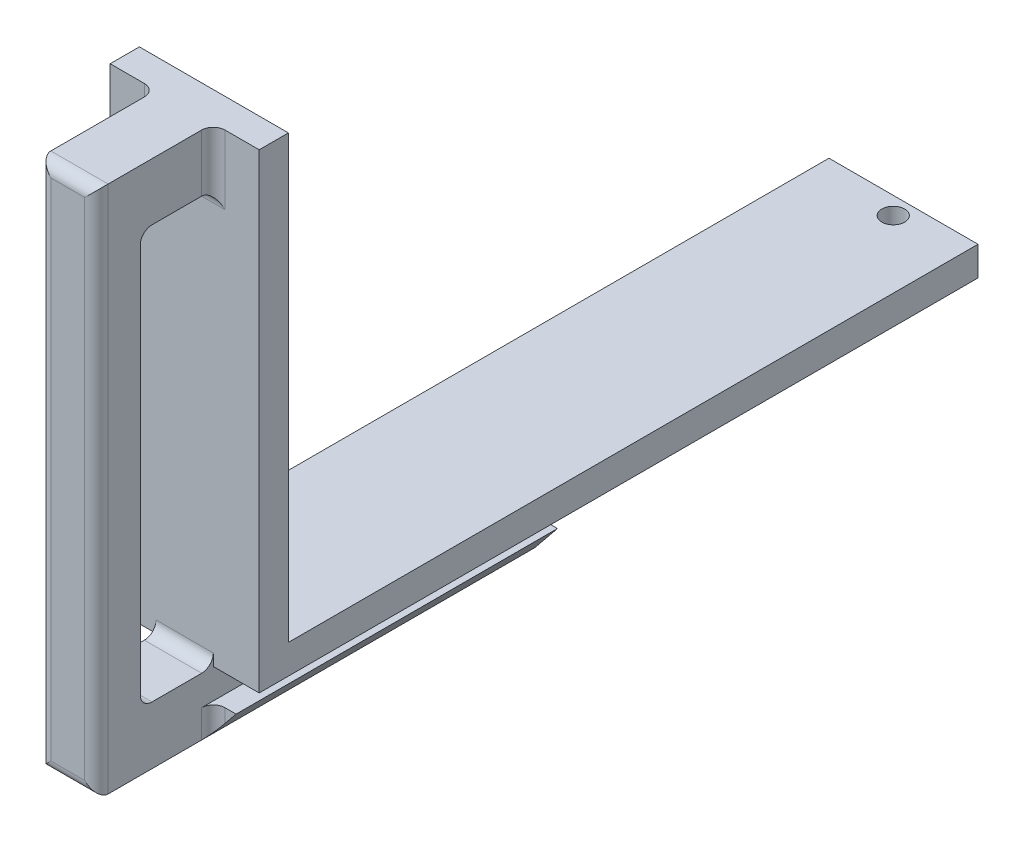
ISO-10303-21;
HEADER;
FILE_DESCRIPTION(('STEP AP214'),'2;1');
FILE_NAME('part.step','',(''),(''),'','','');
FILE_SCHEMA(('AUTOMOTIVE_DESIGN { 1 0 10303 214 1 1 1 1 }'));
ENDSEC;
DATA;
#1=APPLICATION_CONTEXT('core data for automotive mechanical design processes');
#2=APPLICATION_PROTOCOL_DEFINITION('international standard','automotive_design',2000,#1);
#3=PRODUCT_CONTEXT('',#1,'mechanical');
#4=PRODUCT('Part','Part','',(#3));
#5=PRODUCT_RELATED_PRODUCT_CATEGORY('part','',(#4));
#6=PRODUCT_DEFINITION_FORMATION('','',#4);
#7=PRODUCT_DEFINITION_CONTEXT('part definition',#1,'design');
#8=PRODUCT_DEFINITION('design','',#6,#7);
#9=PRODUCT_DEFINITION_SHAPE('','',#8);
#10=(LENGTH_UNIT() NAMED_UNIT(*) SI_UNIT(.MILLI.,.METRE.));
#11=(NAMED_UNIT(*) PLANE_ANGLE_UNIT() SI_UNIT($,.RADIAN.));
#12=(NAMED_UNIT(*) SI_UNIT($,.STERADIAN.) SOLID_ANGLE_UNIT());
#13=UNCERTAINTY_MEASURE_WITH_UNIT(LENGTH_MEASURE(1.E-05),#10,'distance_accuracy_value','');
#14=(GEOMETRIC_REPRESENTATION_CONTEXT(3) GLOBAL_UNCERTAINTY_ASSIGNED_CONTEXT((#13)) GLOBAL_UNIT_ASSIGNED_CONTEXT((#10,
#11,#12)) REPRESENTATION_CONTEXT('',''));
#15=CARTESIAN_POINT('',(0.,0.,0.));
#16=DIRECTION('',(0.,0.,1.));
#17=DIRECTION('',(1.,0.,0.));
#18=AXIS2_PLACEMENT_3D('',#15,#16,#17);
#19=CARTESIAN_POINT('',(0.,0.,64.));
#20=DIRECTION('',(0.,0.,1.));
#21=DIRECTION('',(1.,0.,0.));
#22=AXIS2_PLACEMENT_3D('',#19,#20,#21);
#23=PLANE('',#22);
#24=DIRECTION('',(-1.,0.,0.));
#25=VECTOR('',#24,1.);
#26=CARTESIAN_POINT('',(4.9,-5.1,64.));
#27=LINE('',#26,#25);
#28=CARTESIAN_POINT('',(8.8,-5.1,64.));
#29=VERTEX_POINT('',#28);
#30=CARTESIAN_POINT('',(6.9,-5.1,64.));
#31=VERTEX_POINT('',#30);
#32=EDGE_CURVE('E143',#29,#31,#27,.T.);
#33=ORIENTED_EDGE('',*,*,#32,.T.);
#34=DIRECTION('',(0.,1.,0.));
#35=VECTOR('',#34,1.);
#36=CARTESIAN_POINT('',(6.9,-9.9,64.));
#37=LINE('',#36,#35);
#38=CARTESIAN_POINT('',(6.9,-7.43846153846153,64.));
#39=VERTEX_POINT('',#38);
#40=EDGE_CURVE('E157',#31,#39,#37,.F.);
#41=ORIENTED_EDGE('',*,*,#40,.T.);
#42=DIRECTION('',(0.630592625094465,0.776114000116266,0.));
#43=VECTOR('',#42,1.);
#44=CARTESIAN_POINT('',(8.8,-5.1,64.));
#45=LINE('',#44,#43);
#46=EDGE_CURVE('E159',#39,#29,#45,.T.);
#47=ORIENTED_EDGE('',*,*,#46,.T.);
#48=EDGE_LOOP('',(#33,#41,#47));
#49=FACE_BOUND('',#48,.T.);
#50=ADVANCED_FACE('F44',(#49),#23,.T.);
#51=DIRECTION('',(1.,0.,0.));
#52=VECTOR('',#51,1.);
#53=CARTESIAN_POINT('',(-4.9,0.,64.));
#54=LINE('',#53,#52);
#55=CARTESIAN_POINT('',(-12.75,0.,64.));
#56=VERTEX_POINT('',#55);
#57=CARTESIAN_POINT('',(-4.9,0.,64.));
#58=VERTEX_POINT('',#57);
#59=EDGE_CURVE('E284',#56,#58,#54,.T.);
#60=ORIENTED_EDGE('',*,*,#59,.T.);
#61=DIRECTION('',(0.,1.,0.));
#62=VECTOR('',#61,1.);
#63=CARTESIAN_POINT('',(-4.9,0.,64.));
#64=LINE('',#63,#62);
#65=CARTESIAN_POINT('',(-4.9,2.,64.));
#66=VERTEX_POINT('',#65);
#67=EDGE_CURVE('E71',#58,#66,#64,.T.);
#68=ORIENTED_EDGE('',*,*,#67,.T.);
#69=DIRECTION('',(-1.,0.,0.));
#70=VECTOR('',#69,1.);
#71=CARTESIAN_POINT('',(0.,2.,64.));
#72=LINE('',#71,#70);
#73=CARTESIAN_POINT('',(4.9,2.,64.));
#74=VERTEX_POINT('',#73);
#75=EDGE_CURVE('E270',#66,#74,#72,.F.);
#76=ORIENTED_EDGE('',*,*,#75,.T.);
#77=DIRECTION('',(0.,-1.,0.));
#78=VECTOR('',#77,1.);
#79=CARTESIAN_POINT('',(4.9,-5.1,64.));
#80=LINE('',#79,#78);
#81=CARTESIAN_POINT('',(4.9,0.,64.));
#82=VERTEX_POINT('',#81);
#83=EDGE_CURVE('E265',#74,#82,#80,.T.);
#84=ORIENTED_EDGE('',*,*,#83,.T.);
#85=CARTESIAN_POINT('',(12.75,0.,64.));
#86=VERTEX_POINT('',#85);
#87=EDGE_CURVE('E343',#82,#86,#54,.T.);
#88=ORIENTED_EDGE('',*,*,#87,.T.);
#89=DIRECTION('',(0.,-1.,0.));
#90=VECTOR('',#89,1.);
#91=CARTESIAN_POINT('',(12.75,80.5,64.));
#92=LINE('',#91,#90);
#93=CARTESIAN_POINT('',(12.75,80.5,64.));
#94=VERTEX_POINT('',#93);
#95=EDGE_CURVE('E373',#94,#86,#92,.T.);
#96=ORIENTED_EDGE('',*,*,#95,.F.);
#97=DIRECTION('',(1.,0.,0.));
#98=VECTOR('',#97,1.);
#99=CARTESIAN_POINT('',(-12.75,80.5,64.));
#100=LINE('',#99,#98);
#101=CARTESIAN_POINT('',(6.89999999999999,80.5,64.));
#102=VERTEX_POINT('',#101);
#103=EDGE_CURVE('E348',#102,#94,#100,.T.);
#104=ORIENTED_EDGE('',*,*,#103,.F.);
#105=DIRECTION('',(0.,1.,0.));
#106=VECTOR('',#105,1.);
#107=CARTESIAN_POINT('',(6.89999999999999,70.7,64.));
#108=LINE('',#107,#106);
#109=CARTESIAN_POINT('',(6.89999999999999,68.7,64.));
#110=VERTEX_POINT('',#109);
#111=EDGE_CURVE('E272',#102,#110,#108,.F.);
#112=ORIENTED_EDGE('',*,*,#111,.T.);
#113=DIRECTION('',(1.,0.,0.));
#114=VECTOR('',#113,1.);
#115=CARTESIAN_POINT('',(0.,68.7,64.));
#116=LINE('',#115,#114);
#117=CARTESIAN_POINT('',(-6.90000000000001,68.7,64.));
#118=VERTEX_POINT('',#117);
#119=EDGE_CURVE('E251',#110,#118,#116,.F.);
#120=ORIENTED_EDGE('',*,*,#119,.T.);
#121=DIRECTION('',(0.,-1.,0.));
#122=VECTOR('',#121,1.);
#123=CARTESIAN_POINT('',(-6.90000000000001,80.5,64.));
#124=LINE('',#123,#122);
#125=CARTESIAN_POINT('',(-6.90000000000001,80.5,64.));
#126=VERTEX_POINT('',#125);
#127=EDGE_CURVE('E259',#118,#126,#124,.F.);
#128=ORIENTED_EDGE('',*,*,#127,.T.);
#129=CARTESIAN_POINT('',(-12.75,80.5,64.));
#130=VERTEX_POINT('',#129);
#131=EDGE_CURVE('E344',#130,#126,#100,.T.);
#132=ORIENTED_EDGE('',*,*,#131,.F.);
#133=DIRECTION('',(0.,-1.,0.));
#134=VECTOR('',#133,1.);
#135=CARTESIAN_POINT('',(-12.75,80.5,64.));
#136=LINE('',#135,#134);
#137=EDGE_CURVE('E360',#130,#56,#136,.T.);
#138=ORIENTED_EDGE('',*,*,#137,.T.);
#139=EDGE_LOOP('',(#60,#68,#76,#84,#88,#96,#104,#112,#120,#128,#132,#138));
#140=FACE_BOUND('',#139,.T.);
#141=ADVANCED_FACE('F280',(#140),#23,.T.);
#142=DIRECTION('',(0.630592625094465,-0.776114000116266,0.));
#143=VECTOR('',#142,1.);
#144=CARTESIAN_POINT('',(-8.8,-5.1,64.));
#145=LINE('',#144,#143);
#146=CARTESIAN_POINT('',(-8.8,-5.1,64.));
#147=VERTEX_POINT('',#146);
#148=CARTESIAN_POINT('',(-6.9,-7.43846153846154,64.));
#149=VERTEX_POINT('',#148);
#150=EDGE_CURVE('E381',#147,#149,#145,.T.);
#151=ORIENTED_EDGE('',*,*,#150,.T.);
#152=DIRECTION('',(0.,1.,0.));
#153=VECTOR('',#152,1.);
#154=CARTESIAN_POINT('',(-6.9,-5.1,64.));
#155=LINE('',#154,#153);
#156=CARTESIAN_POINT('',(-6.9,-5.1,64.));
#157=VERTEX_POINT('',#156);
#158=EDGE_CURVE('E169',#149,#157,#155,.T.);
#159=ORIENTED_EDGE('',*,*,#158,.T.);
#160=DIRECTION('',(-1.,0.,0.));
#161=VECTOR('',#160,1.);
#162=CARTESIAN_POINT('',(-4.9,-5.1,64.));
#163=LINE('',#162,#161);
#164=EDGE_CURVE('E377',#157,#147,#163,.T.);
#165=ORIENTED_EDGE('',*,*,#164,.T.);
#166=EDGE_LOOP('',(#151,#159,#165));
#167=FACE_BOUND('',#166,.T.);
#168=ADVANCED_FACE('F687',(#167),#23,.T.);
#169=CARTESIAN_POINT('',(12.75,5.,59.));
#170=DIRECTION('',(-1.,0.,0.));
#171=DIRECTION('',(0.,0.,1.));
#172=AXIS2_PLACEMENT_3D('',#169,#170,#171);
#173=PLANE('',#172);
#174=DIRECTION('',(0.,0.,-1.));
#175=VECTOR('',#174,1.);
#176=CARTESIAN_POINT('',(12.75,0.,59.));
#177=LINE('',#176,#175);
#178=CARTESIAN_POINT('',(12.75,0.,-59.));
#179=VERTEX_POINT('',#178);
#180=EDGE_CURVE('E432',#86,#179,#177,.T.);
#181=ORIENTED_EDGE('',*,*,#180,.T.);
#182=DIRECTION('',(0.,-1.,0.));
#183=VECTOR('',#182,1.);
#184=CARTESIAN_POINT('',(12.75,5.,-59.));
#185=LINE('',#184,#183);
#186=CARTESIAN_POINT('',(12.75,5.,-59.));
#187=VERTEX_POINT('',#186);
#188=EDGE_CURVE('E482',#187,#179,#185,.T.);
#189=ORIENTED_EDGE('',*,*,#188,.F.);
#190=DIRECTION('',(0.,0.,-1.));
#191=VECTOR('',#190,1.);
#192=CARTESIAN_POINT('',(12.75,5.,59.));
#193=LINE('',#192,#191);
#194=CARTESIAN_POINT('',(12.75,5.,59.));
#195=VERTEX_POINT('',#194);
#196=EDGE_CURVE('E451',#195,#187,#193,.T.);
#197=ORIENTED_EDGE('',*,*,#196,.F.);
#198=DIRECTION('',(0.,-1.,0.));
#199=VECTOR('',#198,1.);
#200=CARTESIAN_POINT('',(12.75,80.5,59.));
#201=LINE('',#200,#199);
#202=CARTESIAN_POINT('',(12.75,80.5,59.));
#203=VERTEX_POINT('',#202);
#204=EDGE_CURVE('E369',#203,#195,#201,.T.);
#205=ORIENTED_EDGE('',*,*,#204,.F.);
#206=DIRECTION('',(0.,0.,-1.));
#207=VECTOR('',#206,1.);
#208=CARTESIAN_POINT('',(12.75,80.5,64.));
#209=LINE('',#208,#207);
#210=EDGE_CURVE('E347',#94,#203,#209,.T.);
#211=ORIENTED_EDGE('',*,*,#210,.F.);
#212=ORIENTED_EDGE('',*,*,#95,.T.);
#213=EDGE_LOOP('',(#181,#189,#197,#205,#211,#212));
#214=FACE_BOUND('',#213,.T.);
#215=ADVANCED_FACE('F651',(#214),#173,.F.);
#216=CARTESIAN_POINT('',(-12.75,5.,-59.));
#217=DIRECTION('',(0.,0.,1.));
#218=DIRECTION('',(1.,0.,0.));
#219=AXIS2_PLACEMENT_3D('',#216,#217,#218);
#220=PLANE('',#219);
#221=DIRECTION('',(-1.,0.,0.));
#222=VECTOR('',#221,1.);
#223=CARTESIAN_POINT('',(-12.75,0.,-59.));
#224=LINE('',#223,#222);
#225=CARTESIAN_POINT('',(-12.75,0.,-59.));
#226=VERTEX_POINT('',#225);
#227=EDGE_CURVE('E472',#179,#226,#224,.T.);
#228=ORIENTED_EDGE('',*,*,#227,.T.);
#229=DIRECTION('',(0.,-1.,0.));
#230=VECTOR('',#229,1.);
#231=CARTESIAN_POINT('',(-12.75,5.,-59.));
#232=LINE('',#231,#230);
#233=CARTESIAN_POINT('',(-12.75,5.,-59.));
#234=VERTEX_POINT('',#233);
#235=EDGE_CURVE('E468',#234,#226,#232,.T.);
#236=ORIENTED_EDGE('',*,*,#235,.F.);
#237=DIRECTION('',(-1.,0.,0.));
#238=VECTOR('',#237,1.);
#239=CARTESIAN_POINT('',(-12.75,5.,-59.));
#240=LINE('',#239,#238);
#241=EDGE_CURVE('E455',#187,#234,#240,.T.);
#242=ORIENTED_EDGE('',*,*,#241,.F.);
#243=ORIENTED_EDGE('',*,*,#188,.T.);
#244=EDGE_LOOP('',(#228,#236,#242,#243));
#245=FACE_BOUND('',#244,.T.);
#246=ADVANCED_FACE('F694',(#245),#220,.F.);
#247=CARTESIAN_POINT('',(-12.75,5.,59.));
#248=DIRECTION('',(1.,0.,0.));
#249=DIRECTION('',(0.,0.,-1.));
#250=AXIS2_PLACEMENT_3D('',#247,#248,#249);
#251=PLANE('',#250);
#252=DIRECTION('',(0.,0.,1.));
#253=VECTOR('',#252,1.);
#254=CARTESIAN_POINT('',(-12.75,0.,59.));
#255=LINE('',#254,#253);
#256=EDGE_CURVE('E456',#226,#56,#255,.T.);
#257=ORIENTED_EDGE('',*,*,#256,.T.);
#258=ORIENTED_EDGE('',*,*,#137,.F.);
#259=DIRECTION('',(0.,0.,1.));
#260=VECTOR('',#259,1.);
#261=CARTESIAN_POINT('',(-12.75,80.5,59.));
#262=LINE('',#261,#260);
#263=CARTESIAN_POINT('',(-12.75,80.5,59.));
#264=VERTEX_POINT('',#263);
#265=EDGE_CURVE('E356',#264,#130,#262,.T.);
#266=ORIENTED_EDGE('',*,*,#265,.F.);
#267=DIRECTION('',(0.,-1.,0.));
#268=VECTOR('',#267,1.);
#269=CARTESIAN_POINT('',(-12.75,80.5,59.));
#270=LINE('',#269,#268);
#271=CARTESIAN_POINT('',(-12.75,5.,59.));
#272=VERTEX_POINT('',#271);
#273=EDGE_CURVE('E365',#264,#272,#270,.T.);
#274=ORIENTED_EDGE('',*,*,#273,.T.);
#275=DIRECTION('',(0.,0.,1.));
#276=VECTOR('',#275,1.);
#277=CARTESIAN_POINT('',(-12.75,5.,59.));
#278=LINE('',#277,#276);
#279=EDGE_CURVE('E460',#234,#272,#278,.T.);
#280=ORIENTED_EDGE('',*,*,#279,.F.);
#281=ORIENTED_EDGE('',*,*,#235,.T.);
#282=EDGE_LOOP('',(#257,#258,#266,#274,#280,#281));
#283=FACE_BOUND('',#282,.T.);
#284=ADVANCED_FACE('F661',(#283),#251,.F.);
#285=CARTESIAN_POINT('',(0.,5.,0.));
#286=DIRECTION('',(0.,-1.,0.));
#287=DIRECTION('',(0.,0.,-1.));
#288=AXIS2_PLACEMENT_3D('',#285,#286,#287);
#289=PLANE('',#288);
#290=CARTESIAN_POINT('',(1.24999999999997,5.,-56.));
#291=DIRECTION('',(0.,1.,0.));
#292=DIRECTION('',(0.,0.,1.));
#293=AXIS2_PLACEMENT_3D('',#290,#291,#292);
#294=CIRCLE('',#293,1.95);
#295=CARTESIAN_POINT('',(1.24999999999997,5.,-54.05));
#296=VERTEX_POINT('',#295);
#297=EDGE_CURVE('E387',#296,#296,#294,.T.);
#298=ORIENTED_EDGE('',*,*,#297,.F.);
#299=EDGE_LOOP('',(#298));
#300=FACE_BOUND('',#299,.T.);
#301=CARTESIAN_POINT('',(1.24999999999998,5.,56.));
#302=DIRECTION('',(0.,1.,0.));
#303=DIRECTION('',(0.,0.,1.));
#304=AXIS2_PLACEMENT_3D('',#301,#302,#303);
#305=CIRCLE('',#304,1.95);
#306=CARTESIAN_POINT('',(1.24999999999998,5.,57.95));
#307=VERTEX_POINT('',#306);
#308=EDGE_CURVE('E392',#307,#307,#305,.T.);
#309=ORIENTED_EDGE('',*,*,#308,.F.);
#310=EDGE_LOOP('',(#309));
#311=FACE_BOUND('',#310,.T.);
#312=ORIENTED_EDGE('',*,*,#196,.T.);
#313=ORIENTED_EDGE('',*,*,#241,.T.);
#314=ORIENTED_EDGE('',*,*,#279,.T.);
#315=DIRECTION('',(1.,0.,0.));
#316=VECTOR('',#315,1.);
#317=CARTESIAN_POINT('',(-12.75,5.,59.));
#318=LINE('',#317,#316);
#319=EDGE_CURVE('E464',#272,#195,#318,.T.);
#320=ORIENTED_EDGE('',*,*,#319,.T.);
#321=EDGE_LOOP('',(#312,#313,#314,#320));
#322=FACE_BOUND('',#321,.T.);
#323=ADVANCED_FACE('F1030',(#300,#311,#322),#289,.F.);
#324=CARTESIAN_POINT('',(0.,0.,0.));
#325=DIRECTION('',(0.,-1.,0.));
#326=DIRECTION('',(0.,0.,-1.));
#327=AXIS2_PLACEMENT_3D('',#324,#325,#326);
#328=PLANE('',#327);
#329=CARTESIAN_POINT('',(1.24999999999997,0.,-56.));
#330=DIRECTION('',(0.,-1.,0.));
#331=DIRECTION('',(0.,0.,-1.));
#332=AXIS2_PLACEMENT_3D('',#329,#330,#331);
#333=CIRCLE('',#332,1.95);
#334=CARTESIAN_POINT('',(1.24999999999997,0.,-57.95));
#335=VERTEX_POINT('',#334);
#336=EDGE_CURVE('E391',#335,#335,#333,.T.);
#337=ORIENTED_EDGE('',*,*,#336,.F.);
#338=EDGE_LOOP('',(#337));
#339=FACE_BOUND('',#338,.T.);
#340=DIRECTION('',(0.,0.,1.));
#341=VECTOR('',#340,1.);
#342=CARTESIAN_POINT('',(4.9,0.,8.99999999999999));
#343=LINE('',#342,#341);
#344=CARTESIAN_POINT('',(4.9,0.,8.99999999999999));
#345=VERTEX_POINT('',#344);
#346=EDGE_CURVE('E429',#345,#82,#343,.T.);
#347=ORIENTED_EDGE('',*,*,#346,.F.);
#348=DIRECTION('',(-1.,0.,0.));
#349=VECTOR('',#348,1.);
#350=CARTESIAN_POINT('',(4.9,0.,8.99999999999999));
#351=LINE('',#350,#349);
#352=CARTESIAN_POINT('',(-4.9,0.,8.99999999999999));
#353=VERTEX_POINT('',#352);
#354=EDGE_CURVE('E399',#345,#353,#351,.T.);
#355=ORIENTED_EDGE('',*,*,#354,.T.);
#356=DIRECTION('',(0.,0.,1.));
#357=VECTOR('',#356,1.);
#358=CARTESIAN_POINT('',(-4.9,0.,8.99999999999999));
#359=LINE('',#358,#357);
#360=EDGE_CURVE('E428',#353,#58,#359,.T.);
#361=ORIENTED_EDGE('',*,*,#360,.T.);
#362=ORIENTED_EDGE('',*,*,#59,.F.);
#363=ORIENTED_EDGE('',*,*,#256,.F.);
#364=ORIENTED_EDGE('',*,*,#227,.F.);
#365=ORIENTED_EDGE('',*,*,#180,.F.);
#366=ORIENTED_EDGE('',*,*,#87,.F.);
#367=EDGE_LOOP('',(#347,#355,#361,#362,#363,#364,#365,#366));
#368=FACE_BOUND('',#367,.T.);
#369=ADVANCED_FACE('F667',(#339,#368),#328,.T.);
#370=CARTESIAN_POINT('',(4.9,-5.1,8.99999999999999));
#371=DIRECTION('',(1.,0.,0.));
#372=DIRECTION('',(0.,1.,0.));
#373=AXIS2_PLACEMENT_3D('',#370,#371,#372);
#374=PLANE('',#373);
#375=DIRECTION('',(0.,0.,-1.));
#376=VECTOR('',#375,1.);
#377=CARTESIAN_POINT('',(4.90000000000001,80.5,76.5));
#378=LINE('',#377,#376);
#379=CARTESIAN_POINT('',(4.90000000000001,80.5,82.));
#380=VERTEX_POINT('',#379);
#381=CARTESIAN_POINT('',(4.90000000000001,80.5,66.));
#382=VERTEX_POINT('',#381);
#383=EDGE_CURVE('E339',#380,#382,#378,.T.);
#384=ORIENTED_EDGE('',*,*,#383,.F.);
#385=DIRECTION('',(0.,1.,0.));
#386=VECTOR('',#385,1.);
#387=CARTESIAN_POINT('',(4.9,-9.9,82.));
#388=LINE('',#387,#386);
#389=CARTESIAN_POINT('',(4.89999999999999,-9.9,82.));
#390=VERTEX_POINT('',#389);
#391=EDGE_CURVE('E516',#380,#390,#388,.F.);
#392=ORIENTED_EDGE('',*,*,#391,.T.);
#393=DIRECTION('',(0.,0.,-1.));
#394=VECTOR('',#393,1.);
#395=CARTESIAN_POINT('',(4.89999999999999,-9.9,76.5));
#396=LINE('',#395,#394);
#397=CARTESIAN_POINT('',(4.89999999999999,-9.9,66.));
#398=VERTEX_POINT('',#397);
#399=EDGE_CURVE('E324',#390,#398,#396,.T.);
#400=ORIENTED_EDGE('',*,*,#399,.T.);
#401=DIRECTION('',(0.,1.,0.));
#402=VECTOR('',#401,1.);
#403=CARTESIAN_POINT('',(4.9,-5.1,66.));
#404=LINE('',#403,#402);
#405=CARTESIAN_POINT('',(4.9,-5.1,66.));
#406=VERTEX_POINT('',#405);
#407=EDGE_CURVE('E513',#398,#406,#404,.T.);
#408=ORIENTED_EDGE('',*,*,#407,.T.);
#409=DIRECTION('',(0.,0.,1.));
#410=VECTOR('',#409,1.);
#411=CARTESIAN_POINT('',(4.9,-5.1,8.99999999999999));
#412=LINE('',#411,#410);
#413=CARTESIAN_POINT('',(4.9,-5.1,8.99999999999999));
#414=VERTEX_POINT('',#413);
#415=EDGE_CURVE('E146',#414,#406,#412,.T.);
#416=ORIENTED_EDGE('',*,*,#415,.F.);
#417=DIRECTION('',(0.,1.,0.));
#418=VECTOR('',#417,1.);
#419=CARTESIAN_POINT('',(4.9,-5.1,8.99999999999999));
#420=LINE('',#419,#418);
#421=EDGE_CURVE('E424',#414,#345,#420,.T.);
#422=ORIENTED_EDGE('',*,*,#421,.T.);
#423=ORIENTED_EDGE('',*,*,#346,.T.);
#424=ORIENTED_EDGE('',*,*,#83,.F.);
#425=CARTESIAN_POINT('',(4.9,2.,66.));
#426=DIRECTION('',(1.,0.,0.));
#427=DIRECTION('',(0.,1.,0.));
#428=AXIS2_PLACEMENT_3D('',#425,#426,#427);
#429=CIRCLE('',#428,2.);
#430=CARTESIAN_POINT('',(4.89999999999999,0.,66.));
#431=VERTEX_POINT('',#430);
#432=EDGE_CURVE('E193',#74,#431,#429,.F.);
#433=ORIENTED_EDGE('',*,*,#432,.T.);
#434=DIRECTION('',(0.,0.,-1.));
#435=VECTOR('',#434,1.);
#436=CARTESIAN_POINT('',(4.89999999999999,0.,76.5));
#437=LINE('',#436,#435);
#438=CARTESIAN_POINT('',(4.89999999999999,0.,74.5));
#439=VERTEX_POINT('',#438);
#440=EDGE_CURVE('E298',#439,#431,#437,.T.);
#441=ORIENTED_EDGE('',*,*,#440,.F.);
#442=CARTESIAN_POINT('',(4.9,2.,74.5));
#443=DIRECTION('',(1.,0.,0.));
#444=DIRECTION('',(0.,1.,0.));
#445=AXIS2_PLACEMENT_3D('',#442,#443,#444);
#446=CIRCLE('',#445,2.);
#447=CARTESIAN_POINT('',(4.89999999999999,2.,76.5));
#448=VERTEX_POINT('',#447);
#449=EDGE_CURVE('E215',#439,#448,#446,.F.);
#450=ORIENTED_EDGE('',*,*,#449,.T.);
#451=DIRECTION('',(0.,1.,0.));
#452=VECTOR('',#451,1.);
#453=CARTESIAN_POINT('',(4.89999999999999,80.5,76.5));
#454=LINE('',#453,#452);
#455=CARTESIAN_POINT('',(4.89999999999999,68.7,76.5));
#456=VERTEX_POINT('',#455);
#457=EDGE_CURVE('E312',#448,#456,#454,.T.);
#458=ORIENTED_EDGE('',*,*,#457,.T.);
#459=CARTESIAN_POINT('',(4.89999999999999,68.7,74.5));
#460=DIRECTION('',(1.,0.,0.));
#461=DIRECTION('',(0.,1.,0.));
#462=AXIS2_PLACEMENT_3D('',#459,#460,#461);
#463=CIRCLE('',#462,2.);
#464=CARTESIAN_POINT('',(4.90000000000001,70.7,74.5));
#465=VERTEX_POINT('',#464);
#466=EDGE_CURVE('E205',#456,#465,#463,.F.);
#467=ORIENTED_EDGE('',*,*,#466,.T.);
#468=DIRECTION('',(0.,0.,-1.));
#469=VECTOR('',#468,1.);
#470=CARTESIAN_POINT('',(4.90000000000001,70.7,76.5));
#471=LINE('',#470,#469);
#472=CARTESIAN_POINT('',(4.90000000000001,70.7,66.));
#473=VERTEX_POINT('',#472);
#474=EDGE_CURVE('E327',#465,#473,#471,.T.);
#475=ORIENTED_EDGE('',*,*,#474,.T.);
#476=DIRECTION('',(0.,1.,0.));
#477=VECTOR('',#476,1.);
#478=CARTESIAN_POINT('',(4.89999999999999,80.5,66.));
#479=LINE('',#478,#477);
#480=EDGE_CURVE('E509',#473,#382,#479,.T.);
#481=ORIENTED_EDGE('',*,*,#480,.T.);
#482=EDGE_LOOP('',(#384,#392,#400,#408,#416,#422,#423,#424,#433,#441,#450,#458,#467,#475,#481));
#483=FACE_BOUND('',#482,.T.);
#484=ADVANCED_FACE('F296',(#483),#374,.T.);
#485=CARTESIAN_POINT('',(4.9,-5.1,8.99999999999999));
#486=DIRECTION('',(0.,1.,0.));
#487=DIRECTION('',(0.,0.,1.));
#488=AXIS2_PLACEMENT_3D('',#485,#486,#487);
#489=PLANE('',#488);
#490=ORIENTED_EDGE('',*,*,#415,.T.);
#491=CARTESIAN_POINT('',(6.9,-5.1,66.));
#492=DIRECTION('',(0.,1.,0.));
#493=DIRECTION('',(0.,0.,1.));
#494=AXIS2_PLACEMENT_3D('',#491,#492,#493);
#495=CIRCLE('',#494,2.);
#496=EDGE_CURVE('E138',#406,#31,#495,.F.);
#497=ORIENTED_EDGE('',*,*,#496,.T.);
#498=ORIENTED_EDGE('',*,*,#32,.F.);
#499=DIRECTION('',(0.,0.,1.));
#500=VECTOR('',#499,1.);
#501=CARTESIAN_POINT('',(8.8,-5.1,8.99999999999999));
#502=LINE('',#501,#500);
#503=CARTESIAN_POINT('',(8.8,-5.1,8.99999999999999));
#504=VERTEX_POINT('',#503);
#505=EDGE_CURVE('E435',#504,#29,#502,.T.);
#506=ORIENTED_EDGE('',*,*,#505,.F.);
#507=DIRECTION('',(-1.,0.,0.));
#508=VECTOR('',#507,1.);
#509=CARTESIAN_POINT('',(4.9,-5.1,8.99999999999999));
#510=LINE('',#509,#508);
#511=EDGE_CURVE('E421',#504,#414,#510,.T.);
#512=ORIENTED_EDGE('',*,*,#511,.T.);
#513=EDGE_LOOP('',(#490,#497,#498,#506,#512));
#514=FACE_BOUND('',#513,.T.);
#515=ADVANCED_FACE('F140',(#514),#489,.T.);
#516=CARTESIAN_POINT('',(8.8,-5.1,8.99999999999999));
#517=DIRECTION('',(0.776114000116266,-0.630592625094465,0.));
#518=DIRECTION('',(0.630592625094465,0.776114000116266,0.));
#519=AXIS2_PLACEMENT_3D('',#516,#517,#518);
#520=PLANE('',#519);
#521=ORIENTED_EDGE('',*,*,#505,.T.);
#522=ORIENTED_EDGE('',*,*,#46,.F.);
#523=CARTESIAN_POINT('',(6.9,-7.43846153846153,66.));
#524=DIRECTION('',(0.776114000116266,-0.630592625094465,0.));
#525=DIRECTION('',(-0.630592625094465,-0.776114000116266,0.));
#526=AXIS2_PLACEMENT_3D('',#523,#524,#525);
#527=ELLIPSE('',#526,3.17161971201359,2.);
#528=EDGE_CURVE('E152',#39,#398,#527,.F.);
#529=ORIENTED_EDGE('',*,*,#528,.T.);
#530=DIRECTION('',(0.,0.,1.));
#531=VECTOR('',#530,1.);
#532=CARTESIAN_POINT('',(4.9,-9.9,8.99999999999999));
#533=LINE('',#532,#531);
#534=CARTESIAN_POINT('',(4.9,-9.9,8.99999999999999));
#535=VERTEX_POINT('',#534);
#536=EDGE_CURVE('E62',#535,#398,#533,.T.);
#537=ORIENTED_EDGE('',*,*,#536,.F.);
#538=DIRECTION('',(0.630592625094465,0.776114000116266,0.));
#539=VECTOR('',#538,1.);
#540=CARTESIAN_POINT('',(8.8,-5.1,8.99999999999999));
#541=LINE('',#540,#539);
#542=EDGE_CURVE('E417',#535,#504,#541,.T.);
#543=ORIENTED_EDGE('',*,*,#542,.T.);
#544=EDGE_LOOP('',(#521,#522,#529,#537,#543));
#545=FACE_BOUND('',#544,.T.);
#546=ADVANCED_FACE('F731',(#545),#520,.T.);
#547=CARTESIAN_POINT('',(-4.9,-9.9,8.99999999999999));
#548=DIRECTION('',(0.,-1.,0.));
#549=DIRECTION('',(1.,0.,0.));
#550=AXIS2_PLACEMENT_3D('',#547,#548,#549);
#551=PLANE('',#550);
#552=ORIENTED_EDGE('',*,*,#399,.F.);
#553=DIRECTION('',(1.,0.,0.));
#554=VECTOR('',#553,1.);
#555=CARTESIAN_POINT('',(-4.90000000000001,-9.9,82.));
#556=LINE('',#555,#554);
#557=CARTESIAN_POINT('',(-4.90000000000001,-9.9,82.));
#558=VERTEX_POINT('',#557);
#559=EDGE_CURVE('E95',#390,#558,#556,.F.);
#560=ORIENTED_EDGE('',*,*,#559,.T.);
#561=DIRECTION('',(0.,0.,-1.));
#562=VECTOR('',#561,1.);
#563=CARTESIAN_POINT('',(-4.90000000000001,-9.9,76.5));
#564=LINE('',#563,#562);
#565=CARTESIAN_POINT('',(-4.9,-9.9,66.));
#566=VERTEX_POINT('',#565);
#567=EDGE_CURVE('E316',#558,#566,#564,.T.);
#568=ORIENTED_EDGE('',*,*,#567,.T.);
#569=DIRECTION('',(0.,0.,1.));
#570=VECTOR('',#569,1.);
#571=CARTESIAN_POINT('',(-4.9,-9.9,8.99999999999999));
#572=LINE('',#571,#570);
#573=CARTESIAN_POINT('',(-4.9,-9.9,8.99999999999999));
#574=VERTEX_POINT('',#573);
#575=EDGE_CURVE('E85',#574,#566,#572,.T.);
#576=ORIENTED_EDGE('',*,*,#575,.F.);
#577=DIRECTION('',(1.,0.,0.));
#578=VECTOR('',#577,1.);
#579=CARTESIAN_POINT('',(-4.9,-9.9,8.99999999999999));
#580=LINE('',#579,#578);
#581=EDGE_CURVE('E414',#574,#535,#580,.T.);
#582=ORIENTED_EDGE('',*,*,#581,.T.);
#583=ORIENTED_EDGE('',*,*,#536,.T.);
#584=EDGE_LOOP('',(#552,#560,#568,#576,#582,#583));
#585=FACE_BOUND('',#584,.T.);
#586=ADVANCED_FACE('F560',(#585),#551,.T.);
#587=CARTESIAN_POINT('',(-8.8,-5.1,8.99999999999999));
#588=DIRECTION('',(-0.776114000116266,-0.630592625094465,0.));
#589=DIRECTION('',(0.630592625094465,-0.776114000116266,0.));
#590=AXIS2_PLACEMENT_3D('',#587,#588,#589);
#591=PLANE('',#590);
#592=ORIENTED_EDGE('',*,*,#575,.T.);
#593=CARTESIAN_POINT('',(-6.9,-7.43846153846154,66.));
#594=DIRECTION('',(-0.776114000116266,-0.630592625094465,0.));
#595=DIRECTION('',(0.630592625094465,-0.776114000116266,0.));
#596=AXIS2_PLACEMENT_3D('',#593,#594,#595);
#597=ELLIPSE('',#596,3.17161971201359,2.);
#598=EDGE_CURVE('E153',#566,#149,#597,.F.);
#599=ORIENTED_EDGE('',*,*,#598,.T.);
#600=ORIENTED_EDGE('',*,*,#150,.F.);
#601=DIRECTION('',(0.,0.,1.));
#602=VECTOR('',#601,1.);
#603=CARTESIAN_POINT('',(-8.8,-5.1,8.99999999999999));
#604=LINE('',#603,#602);
#605=CARTESIAN_POINT('',(-8.8,-5.1,8.99999999999999));
#606=VERTEX_POINT('',#605);
#607=EDGE_CURVE('E442',#606,#147,#604,.T.);
#608=ORIENTED_EDGE('',*,*,#607,.F.);
#609=DIRECTION('',(0.630592625094465,-0.776114000116266,0.));
#610=VECTOR('',#609,1.);
#611=CARTESIAN_POINT('',(-8.8,-5.1,8.99999999999999));
#612=LINE('',#611,#610);
#613=EDGE_CURVE('E411',#606,#574,#612,.T.);
#614=ORIENTED_EDGE('',*,*,#613,.T.);
#615=EDGE_LOOP('',(#592,#599,#600,#608,#614));
#616=FACE_BOUND('',#615,.T.);
#617=ADVANCED_FACE('F685',(#616),#591,.T.);
#618=CARTESIAN_POINT('',(-4.9,-5.1,8.99999999999999));
#619=DIRECTION('',(0.,1.,0.));
#620=DIRECTION('',(-1.,0.,0.));
#621=AXIS2_PLACEMENT_3D('',#618,#619,#620);
#622=PLANE('',#621);
#623=ORIENTED_EDGE('',*,*,#607,.T.);
#624=ORIENTED_EDGE('',*,*,#164,.F.);
#625=CARTESIAN_POINT('',(-6.9,-5.1,66.));
#626=DIRECTION('',(0.,1.,0.));
#627=DIRECTION('',(-1.,0.,0.));
#628=AXIS2_PLACEMENT_3D('',#625,#626,#627);
#629=CIRCLE('',#628,2.);
#630=CARTESIAN_POINT('',(-4.9,-5.1,66.));
#631=VERTEX_POINT('',#630);
#632=EDGE_CURVE('E197',#157,#631,#629,.F.);
#633=ORIENTED_EDGE('',*,*,#632,.T.);
#634=DIRECTION('',(0.,0.,1.));
#635=VECTOR('',#634,1.);
#636=CARTESIAN_POINT('',(-4.9,-5.1,8.99999999999999));
#637=LINE('',#636,#635);
#638=CARTESIAN_POINT('',(-4.9,-5.1,8.99999999999999));
#639=VERTEX_POINT('',#638);
#640=EDGE_CURVE('E446',#639,#631,#637,.T.);
#641=ORIENTED_EDGE('',*,*,#640,.F.);
#642=DIRECTION('',(-1.,0.,0.));
#643=VECTOR('',#642,1.);
#644=CARTESIAN_POINT('',(-4.9,-5.1,8.99999999999999));
#645=LINE('',#644,#643);
#646=EDGE_CURVE('E407',#639,#606,#645,.T.);
#647=ORIENTED_EDGE('',*,*,#646,.T.);
#648=EDGE_LOOP('',(#623,#624,#633,#641,#647));
#649=FACE_BOUND('',#648,.T.);
#650=ADVANCED_FACE('F677',(#649),#622,.T.);
#651=CARTESIAN_POINT('',(-4.9,0.,8.99999999999999));
#652=DIRECTION('',(-1.,0.,0.));
#653=DIRECTION('',(0.,-1.,0.));
#654=AXIS2_PLACEMENT_3D('',#651,#652,#653);
#655=PLANE('',#654);
#656=ORIENTED_EDGE('',*,*,#567,.F.);
#657=DIRECTION('',(0.,-1.,0.));
#658=VECTOR('',#657,1.);
#659=CARTESIAN_POINT('',(-4.90000000000001,80.5,82.));
#660=LINE('',#659,#658);
#661=CARTESIAN_POINT('',(-4.9,80.5,82.));
#662=VERTEX_POINT('',#661);
#663=EDGE_CURVE('E527',#558,#662,#660,.F.);
#664=ORIENTED_EDGE('',*,*,#663,.T.);
#665=DIRECTION('',(0.,0.,-1.));
#666=VECTOR('',#665,1.);
#667=CARTESIAN_POINT('',(-4.9,80.5,76.5));
#668=LINE('',#667,#666);
#669=CARTESIAN_POINT('',(-4.9,80.5,66.));
#670=VERTEX_POINT('',#669);
#671=EDGE_CURVE('E335',#662,#670,#668,.T.);
#672=ORIENTED_EDGE('',*,*,#671,.T.);
#673=DIRECTION('',(0.,-1.,0.));
#674=VECTOR('',#673,1.);
#675=CARTESIAN_POINT('',(-4.90000000000001,70.7,66.));
#676=LINE('',#675,#674);
#677=CARTESIAN_POINT('',(-4.9,70.7,66.));
#678=VERTEX_POINT('',#677);
#679=EDGE_CURVE('E257',#670,#678,#676,.T.);
#680=ORIENTED_EDGE('',*,*,#679,.T.);
#681=DIRECTION('',(0.,0.,-1.));
#682=VECTOR('',#681,1.);
#683=CARTESIAN_POINT('',(-4.9,70.7,76.5));
#684=LINE('',#683,#682);
#685=CARTESIAN_POINT('',(-4.9,70.7,74.5));
#686=VERTEX_POINT('',#685);
#687=EDGE_CURVE('E331',#686,#678,#684,.T.);
#688=ORIENTED_EDGE('',*,*,#687,.F.);
#689=CARTESIAN_POINT('',(-4.90000000000001,68.7,74.5));
#690=DIRECTION('',(-1.,0.,0.));
#691=DIRECTION('',(0.,-1.,0.));
#692=AXIS2_PLACEMENT_3D('',#689,#690,#691);
#693=CIRCLE('',#692,2.);
#694=CARTESIAN_POINT('',(-4.9,68.7,76.5));
#695=VERTEX_POINT('',#694);
#696=EDGE_CURVE('E209',#686,#695,#693,.F.);
#697=ORIENTED_EDGE('',*,*,#696,.T.);
#698=DIRECTION('',(0.,-1.,0.));
#699=VECTOR('',#698,1.);
#700=CARTESIAN_POINT('',(-4.90000000000001,-9.9,76.5));
#701=LINE('',#700,#699);
#702=CARTESIAN_POINT('',(-4.90000000000001,2.,76.5));
#703=VERTEX_POINT('',#702);
#704=EDGE_CURVE('E237',#695,#703,#701,.T.);
#705=ORIENTED_EDGE('',*,*,#704,.T.);
#706=CARTESIAN_POINT('',(-4.9,2.,74.5));
#707=DIRECTION('',(-1.,0.,0.));
#708=DIRECTION('',(0.,-1.,0.));
#709=AXIS2_PLACEMENT_3D('',#706,#707,#708);
#710=CIRCLE('',#709,2.);
#711=CARTESIAN_POINT('',(-4.90000000000001,0.,74.5));
#712=VERTEX_POINT('',#711);
#713=EDGE_CURVE('E212',#703,#712,#710,.F.);
#714=ORIENTED_EDGE('',*,*,#713,.T.);
#715=DIRECTION('',(0.,0.,-1.));
#716=VECTOR('',#715,1.);
#717=CARTESIAN_POINT('',(-4.90000000000001,0.,76.5));
#718=LINE('',#717,#716);
#719=CARTESIAN_POINT('',(-4.90000000000001,0.,66.));
#720=VERTEX_POINT('',#719);
#721=EDGE_CURVE('E311',#712,#720,#718,.T.);
#722=ORIENTED_EDGE('',*,*,#721,.T.);
#723=CARTESIAN_POINT('',(-4.9,2.,66.));
#724=DIRECTION('',(-1.,0.,0.));
#725=DIRECTION('',(0.,-1.,0.));
#726=AXIS2_PLACEMENT_3D('',#723,#724,#725);
#727=CIRCLE('',#726,2.);
#728=EDGE_CURVE('E190',#720,#66,#727,.F.);
#729=ORIENTED_EDGE('',*,*,#728,.T.);
#730=ORIENTED_EDGE('',*,*,#67,.F.);
#731=ORIENTED_EDGE('',*,*,#360,.F.);
#732=DIRECTION('',(0.,-1.,0.));
#733=VECTOR('',#732,1.);
#734=CARTESIAN_POINT('',(-4.9,0.,8.99999999999999));
#735=LINE('',#734,#733);
#736=EDGE_CURVE('E403',#353,#639,#735,.T.);
#737=ORIENTED_EDGE('',*,*,#736,.T.);
#738=ORIENTED_EDGE('',*,*,#640,.T.);
#739=DIRECTION('',(0.,1.,0.));
#740=VECTOR('',#739,1.);
#741=CARTESIAN_POINT('',(-4.9,-9.9,66.));
#742=LINE('',#741,#740);
#743=EDGE_CURVE('E524',#631,#566,#742,.F.);
#744=ORIENTED_EDGE('',*,*,#743,.T.);
#745=EDGE_LOOP('',(#656,#664,#672,#680,#688,#697,#705,#714,#722,#729,#730,#731,#737,#738,#744));
#746=FACE_BOUND('',#745,.T.);
#747=ADVANCED_FACE('F669',(#746),#655,.T.);
#748=CARTESIAN_POINT('',(0.,0.,8.99999999999999));
#749=DIRECTION('',(0.,0.,1.));
#750=DIRECTION('',(1.,0.,0.));
#751=AXIS2_PLACEMENT_3D('',#748,#749,#750);
#752=PLANE('',#751);
#753=ORIENTED_EDGE('',*,*,#354,.F.);
#754=ORIENTED_EDGE('',*,*,#421,.F.);
#755=ORIENTED_EDGE('',*,*,#511,.F.);
#756=ORIENTED_EDGE('',*,*,#542,.F.);
#757=ORIENTED_EDGE('',*,*,#581,.F.);
#758=ORIENTED_EDGE('',*,*,#613,.F.);
#759=ORIENTED_EDGE('',*,*,#646,.F.);
#760=ORIENTED_EDGE('',*,*,#736,.F.);
#761=EDGE_LOOP('',(#753,#754,#755,#756,#757,#758,#759,#760));
#762=FACE_BOUND('',#761,.T.);
#763=ADVANCED_FACE('F672',(#762),#752,.F.);
#764=CARTESIAN_POINT('',(1.24999999999997,-5.,-56.));
#765=DIRECTION('',(0.,1.,0.));
#766=DIRECTION('',(0.,0.,1.));
#767=AXIS2_PLACEMENT_3D('',#764,#765,#766);
#768=CYLINDRICAL_SURFACE('',#767,1.95);
#769=ORIENTED_EDGE('',*,*,#336,.T.);
#770=EDGE_LOOP('',(#769));
#771=FACE_BOUND('',#770,.T.);
#772=ORIENTED_EDGE('',*,*,#297,.T.);
#773=EDGE_LOOP('',(#772));
#774=FACE_BOUND('',#773,.T.);
#775=ADVANCED_FACE('F1078',(#771,#774),#768,.F.);
#776=CARTESIAN_POINT('',(1.24999999999998,-5.,56.));
#777=DIRECTION('',(0.,1.,0.));
#778=DIRECTION('',(0.,0.,1.));
#779=AXIS2_PLACEMENT_3D('',#776,#777,#778);
#780=CYLINDRICAL_SURFACE('',#779,1.95);
#781=CARTESIAN_POINT('',(1.24999999999998,-5.,56.));
#782=DIRECTION('',(0.,1.,0.));
#783=DIRECTION('',(0.,0.,1.));
#784=AXIS2_PLACEMENT_3D('',#781,#782,#783);
#785=CIRCLE('',#784,1.95);
#786=CARTESIAN_POINT('',(1.24999999999998,-5.,57.95));
#787=VERTEX_POINT('',#786);
#788=EDGE_CURVE('E162',#787,#787,#785,.T.);
#789=ORIENTED_EDGE('',*,*,#788,.F.);
#790=EDGE_LOOP('',(#789));
#791=FACE_BOUND('',#790,.T.);
#792=ORIENTED_EDGE('',*,*,#308,.T.);
#793=EDGE_LOOP('',(#792));
#794=FACE_BOUND('',#793,.T.);
#795=ADVANCED_FACE('F1067',(#791,#794),#780,.F.);
#796=CARTESIAN_POINT('',(1.24999999999998,-5.,56.));
#797=DIRECTION('',(0.,1.,0.));
#798=DIRECTION('',(0.,0.,1.));
#799=AXIS2_PLACEMENT_3D('',#796,#797,#798);
#800=PLANE('',#799);
#801=ORIENTED_EDGE('',*,*,#788,.T.);
#802=EDGE_LOOP('',(#801));
#803=FACE_BOUND('',#802,.T.);
#804=ADVANCED_FACE('F1022',(#803),#800,.T.);
#805=CARTESIAN_POINT('',(-4.90000000000001,80.5,59.));
#806=DIRECTION('',(0.,0.,1.));
#807=DIRECTION('',(1.,0.,0.));
#808=AXIS2_PLACEMENT_3D('',#805,#806,#807);
#809=PLANE('',#808);
#810=ORIENTED_EDGE('',*,*,#204,.T.);
#811=ORIENTED_EDGE('',*,*,#319,.F.);
#812=ORIENTED_EDGE('',*,*,#273,.F.);
#813=DIRECTION('',(-1.,0.,0.));
#814=VECTOR('',#813,1.);
#815=CARTESIAN_POINT('',(-4.90000000000001,80.5,59.));
#816=LINE('',#815,#814);
#817=EDGE_CURVE('E352',#203,#264,#816,.T.);
#818=ORIENTED_EDGE('',*,*,#817,.F.);
#819=EDGE_LOOP('',(#810,#811,#812,#818));
#820=FACE_BOUND('',#819,.T.);
#821=ADVANCED_FACE('F657',(#820),#809,.F.);
#822=CARTESIAN_POINT('',(0.,80.5,0.));
#823=DIRECTION('',(0.,1.,0.));
#824=DIRECTION('',(-1.,0.,0.));
#825=AXIS2_PLACEMENT_3D('',#822,#823,#824);
#826=PLANE('',#825);
#827=ORIENTED_EDGE('',*,*,#671,.F.);
#828=DIRECTION('',(-1.,0.,0.));
#829=VECTOR('',#828,1.);
#830=CARTESIAN_POINT('',(4.89999999999999,80.5,82.));
#831=LINE('',#830,#829);
#832=EDGE_CURVE('E505',#662,#380,#831,.F.);
#833=ORIENTED_EDGE('',*,*,#832,.T.);
#834=ORIENTED_EDGE('',*,*,#383,.T.);
#835=CARTESIAN_POINT('',(6.89999999999999,80.5,66.));
#836=DIRECTION('',(0.,1.,0.));
#837=DIRECTION('',(-1.,0.,0.));
#838=AXIS2_PLACEMENT_3D('',#835,#836,#837);
#839=CIRCLE('',#838,2.);
#840=EDGE_CURVE('E11',#382,#102,#839,.F.);
#841=ORIENTED_EDGE('',*,*,#840,.T.);
#842=ORIENTED_EDGE('',*,*,#103,.T.);
#843=ORIENTED_EDGE('',*,*,#210,.T.);
#844=ORIENTED_EDGE('',*,*,#817,.T.);
#845=ORIENTED_EDGE('',*,*,#265,.T.);
#846=ORIENTED_EDGE('',*,*,#131,.T.);
#847=CARTESIAN_POINT('',(-6.90000000000001,80.5,66.));
#848=DIRECTION('',(0.,1.,0.));
#849=DIRECTION('',(-1.,0.,0.));
#850=AXIS2_PLACEMENT_3D('',#847,#848,#849);
#851=CIRCLE('',#850,2.);
#852=EDGE_CURVE('E54',#126,#670,#851,.F.);
#853=ORIENTED_EDGE('',*,*,#852,.T.);
#854=EDGE_LOOP('',(#827,#833,#834,#841,#842,#843,#844,#845,#846,#853));
#855=FACE_BOUND('',#854,.T.);
#856=ADVANCED_FACE('F644',(#855),#826,.T.);
#857=CARTESIAN_POINT('',(-4.9,70.7,76.5));
#858=DIRECTION('',(0.,1.,0.));
#859=DIRECTION('',(0.,0.,1.));
#860=AXIS2_PLACEMENT_3D('',#857,#858,#859);
#861=PLANE('',#860);
#862=ORIENTED_EDGE('',*,*,#474,.F.);
#863=DIRECTION('',(1.,0.,0.));
#864=VECTOR('',#863,1.);
#865=CARTESIAN_POINT('',(-4.9,70.7,74.5));
#866=LINE('',#865,#864);
#867=EDGE_CURVE('E187',#465,#686,#866,.F.);
#868=ORIENTED_EDGE('',*,*,#867,.T.);
#869=ORIENTED_EDGE('',*,*,#687,.T.);
#870=DIRECTION('',(1.,0.,0.));
#871=VECTOR('',#870,1.);
#872=CARTESIAN_POINT('',(-4.9,70.7,66.));
#873=LINE('',#872,#871);
#874=EDGE_CURVE('E183',#678,#473,#873,.T.);
#875=ORIENTED_EDGE('',*,*,#874,.T.);
#876=EDGE_LOOP('',(#862,#868,#869,#875));
#877=FACE_BOUND('',#876,.T.);
#878=ADVANCED_FACE('F790',(#877),#861,.F.);
#879=CARTESIAN_POINT('',(-4.90000000000001,0.,76.5));
#880=DIRECTION('',(0.,-1.,0.));
#881=DIRECTION('',(1.,0.,0.));
#882=AXIS2_PLACEMENT_3D('',#879,#880,#881);
#883=PLANE('',#882);
#884=ORIENTED_EDGE('',*,*,#440,.T.);
#885=DIRECTION('',(-1.,0.,0.));
#886=VECTOR('',#885,1.);
#887=CARTESIAN_POINT('',(-4.90000000000001,0.,66.));
#888=LINE('',#887,#886);
#889=EDGE_CURVE('E291',#431,#720,#888,.T.);
#890=ORIENTED_EDGE('',*,*,#889,.T.);
#891=ORIENTED_EDGE('',*,*,#721,.F.);
#892=DIRECTION('',(-1.,0.,0.));
#893=VECTOR('',#892,1.);
#894=CARTESIAN_POINT('',(-4.90000000000001,0.,74.5));
#895=LINE('',#894,#893);
#896=EDGE_CURVE('E309',#712,#439,#895,.F.);
#897=ORIENTED_EDGE('',*,*,#896,.T.);
#898=EDGE_LOOP('',(#884,#890,#891,#897));
#899=FACE_BOUND('',#898,.T.);
#900=ADVANCED_FACE('F305',(#899),#883,.F.);
#901=CARTESIAN_POINT('',(0.,0.,84.));
#902=DIRECTION('',(0.,0.,-1.));
#903=DIRECTION('',(-1.,0.,0.));
#904=AXIS2_PLACEMENT_3D('',#901,#902,#903);
#905=PLANE('',#904);
#906=DIRECTION('',(0.,1.,0.));
#907=VECTOR('',#906,1.);
#908=CARTESIAN_POINT('',(2.89999999999999,80.5,84.));
#909=LINE('',#908,#907);
#910=CARTESIAN_POINT('',(2.9,-7.9,84.));
#911=VERTEX_POINT('',#910);
#912=CARTESIAN_POINT('',(2.89999999999999,78.5,84.));
#913=VERTEX_POINT('',#912);
#914=EDGE_CURVE('E497',#911,#913,#909,.T.);
#915=ORIENTED_EDGE('',*,*,#914,.T.);
#916=DIRECTION('',(-1.,0.,0.));
#917=VECTOR('',#916,1.);
#918=CARTESIAN_POINT('',(-4.9,78.5,84.));
#919=LINE('',#918,#917);
#920=CARTESIAN_POINT('',(-2.90000000000001,78.5,84.));
#921=VERTEX_POINT('',#920);
#922=EDGE_CURVE('E501',#913,#921,#919,.T.);
#923=ORIENTED_EDGE('',*,*,#922,.T.);
#924=DIRECTION('',(0.,-1.,0.));
#925=VECTOR('',#924,1.);
#926=CARTESIAN_POINT('',(-2.9,-9.9,84.));
#927=LINE('',#926,#925);
#928=CARTESIAN_POINT('',(-2.9,-7.9,84.));
#929=VERTEX_POINT('',#928);
#930=EDGE_CURVE('E486',#921,#929,#927,.T.);
#931=ORIENTED_EDGE('',*,*,#930,.T.);
#932=DIRECTION('',(1.,0.,0.));
#933=VECTOR('',#932,1.);
#934=CARTESIAN_POINT('',(4.89999999999999,-7.9,84.));
#935=LINE('',#934,#933);
#936=EDGE_CURVE('E493',#929,#911,#935,.T.);
#937=ORIENTED_EDGE('',*,*,#936,.T.);
#938=EDGE_LOOP('',(#915,#923,#931,#937));
#939=FACE_BOUND('',#938,.T.);
#940=ADVANCED_FACE('F575',(#939),#905,.F.);
#941=CARTESIAN_POINT('',(0.,0.,76.5));
#942=DIRECTION('',(0.,0.,-1.));
#943=DIRECTION('',(-1.,0.,0.));
#944=AXIS2_PLACEMENT_3D('',#941,#942,#943);
#945=PLANE('',#944);
#946=ORIENTED_EDGE('',*,*,#704,.F.);
#947=DIRECTION('',(1.,0.,0.));
#948=VECTOR('',#947,1.);
#949=CARTESIAN_POINT('',(0.,68.7,76.5));
#950=LINE('',#949,#948);
#951=EDGE_CURVE('E174',#695,#456,#950,.T.);
#952=ORIENTED_EDGE('',*,*,#951,.T.);
#953=ORIENTED_EDGE('',*,*,#457,.F.);
#954=DIRECTION('',(-1.,0.,0.));
#955=VECTOR('',#954,1.);
#956=CARTESIAN_POINT('',(0.,2.,76.5));
#957=LINE('',#956,#955);
#958=EDGE_CURVE('E168',#448,#703,#957,.T.);
#959=ORIENTED_EDGE('',*,*,#958,.T.);
#960=EDGE_LOOP('',(#946,#952,#953,#959));
#961=FACE_BOUND('',#960,.T.);
#962=ADVANCED_FACE('F820',(#961),#945,.T.);
#963=CARTESIAN_POINT('',(0.,-7.9,82.));
#964=DIRECTION('',(-1.,0.,0.));
#965=DIRECTION('',(0.,-1.,0.));
#966=AXIS2_PLACEMENT_3D('',#963,#964,#965);
#967=CYLINDRICAL_SURFACE('',#966,2.);
#968=CARTESIAN_POINT('',(-2.9,-7.9,82.));
#969=DIRECTION('',(-0.707106781186548,0.707106781186547,0.));
#970=DIRECTION('',(0.707106781186547,0.707106781186548,0.));
#971=AXIS2_PLACEMENT_3D('',#968,#969,#970);
#972=ELLIPSE('',#971,2.82842712474619,2.);
#973=EDGE_CURVE('E230',#558,#929,#972,.T.);
#974=ORIENTED_EDGE('',*,*,#973,.F.);
#975=ORIENTED_EDGE('',*,*,#559,.F.);
#976=CARTESIAN_POINT('',(2.9,-7.9,82.));
#977=DIRECTION('',(-0.707106781186547,-0.707106781186548,0.));
#978=DIRECTION('',(-0.707106781186548,0.707106781186547,0.));
#979=AXIS2_PLACEMENT_3D('',#976,#977,#978);
#980=ELLIPSE('',#979,2.82842712474619,2.);
#981=EDGE_CURVE('E234',#911,#390,#980,.F.);
#982=ORIENTED_EDGE('',*,*,#981,.F.);
#983=ORIENTED_EDGE('',*,*,#936,.F.);
#984=EDGE_LOOP('',(#974,#975,#982,#983));
#985=FACE_BOUND('',#984,.T.);
#986=ADVANCED_FACE('F564',(#985),#967,.T.);
#987=CARTESIAN_POINT('',(2.9,0.,82.));
#988=DIRECTION('',(0.,-1.,0.));
#989=DIRECTION('',(1.,0.,0.));
#990=AXIS2_PLACEMENT_3D('',#987,#988,#989);
#991=CYLINDRICAL_SURFACE('',#990,2.);
#992=ORIENTED_EDGE('',*,*,#981,.T.);
#993=ORIENTED_EDGE('',*,*,#391,.F.);
#994=CARTESIAN_POINT('',(2.89999999999999,78.5,82.));
#995=DIRECTION('',(0.707106781186548,-0.707106781186547,0.));
#996=DIRECTION('',(-0.707106781186547,-0.707106781186548,0.));
#997=AXIS2_PLACEMENT_3D('',#994,#995,#996);
#998=ELLIPSE('',#997,2.82842712474619,2.);
#999=EDGE_CURVE('E226',#913,#380,#998,.F.);
#1000=ORIENTED_EDGE('',*,*,#999,.F.);
#1001=ORIENTED_EDGE('',*,*,#914,.F.);
#1002=EDGE_LOOP('',(#992,#993,#1000,#1001));
#1003=FACE_BOUND('',#1002,.T.);
#1004=ADVANCED_FACE('F569',(#1003),#991,.T.);
#1005=CARTESIAN_POINT('',(-2.9,0.,82.));
#1006=DIRECTION('',(0.,1.,0.));
#1007=DIRECTION('',(-1.,0.,0.));
#1008=AXIS2_PLACEMENT_3D('',#1005,#1006,#1007);
#1009=CYLINDRICAL_SURFACE('',#1008,2.);
#1010=ORIENTED_EDGE('',*,*,#973,.T.);
#1011=ORIENTED_EDGE('',*,*,#930,.F.);
#1012=CARTESIAN_POINT('',(-2.90000000000001,78.5,82.));
#1013=DIRECTION('',(0.707106781186547,0.707106781186548,0.));
#1014=DIRECTION('',(-0.707106781186548,0.707106781186547,0.));
#1015=AXIS2_PLACEMENT_3D('',#1012,#1013,#1014);
#1016=ELLIPSE('',#1015,2.82842712474619,2.);
#1017=EDGE_CURVE('E222',#662,#921,#1016,.T.);
#1018=ORIENTED_EDGE('',*,*,#1017,.F.);
#1019=ORIENTED_EDGE('',*,*,#663,.F.);
#1020=EDGE_LOOP('',(#1010,#1011,#1018,#1019));
#1021=FACE_BOUND('',#1020,.T.);
#1022=ADVANCED_FACE('F591',(#1021),#1009,.T.);
#1023=CARTESIAN_POINT('',(0.,78.5,82.));
#1024=DIRECTION('',(1.,0.,0.));
#1025=DIRECTION('',(0.,1.,0.));
#1026=AXIS2_PLACEMENT_3D('',#1023,#1024,#1025);
#1027=CYLINDRICAL_SURFACE('',#1026,2.);
#1028=ORIENTED_EDGE('',*,*,#999,.T.);
#1029=ORIENTED_EDGE('',*,*,#832,.F.);
#1030=ORIENTED_EDGE('',*,*,#1017,.T.);
#1031=ORIENTED_EDGE('',*,*,#922,.F.);
#1032=EDGE_LOOP('',(#1028,#1029,#1030,#1031));
#1033=FACE_BOUND('',#1032,.T.);
#1034=ADVANCED_FACE('F585',(#1033),#1027,.T.);
#1035=CARTESIAN_POINT('',(-4.90000000000001,2.,66.));
#1036=DIRECTION('',(-1.,0.,0.));
#1037=DIRECTION('',(0.,-1.,0.));
#1038=AXIS2_PLACEMENT_3D('',#1035,#1036,#1037);
#1039=CYLINDRICAL_SURFACE('',#1038,2.);
#1040=ORIENTED_EDGE('',*,*,#432,.F.);
#1041=ORIENTED_EDGE('',*,*,#75,.F.);
#1042=ORIENTED_EDGE('',*,*,#728,.F.);
#1043=ORIENTED_EDGE('',*,*,#889,.F.);
#1044=EDGE_LOOP('',(#1040,#1041,#1042,#1043));
#1045=FACE_BOUND('',#1044,.T.);
#1046=ADVANCED_FACE('F287',(#1045),#1039,.F.);
#1047=CARTESIAN_POINT('',(-6.9,0.,66.));
#1048=DIRECTION('',(0.,-1.,0.));
#1049=DIRECTION('',(1.,0.,0.));
#1050=AXIS2_PLACEMENT_3D('',#1047,#1048,#1049);
#1051=CYLINDRICAL_SURFACE('',#1050,2.);
#1052=ORIENTED_EDGE('',*,*,#598,.F.);
#1053=ORIENTED_EDGE('',*,*,#743,.F.);
#1054=ORIENTED_EDGE('',*,*,#632,.F.);
#1055=ORIENTED_EDGE('',*,*,#158,.F.);
#1056=EDGE_LOOP('',(#1052,#1053,#1054,#1055));
#1057=FACE_BOUND('',#1056,.T.);
#1058=ADVANCED_FACE('F684',(#1057),#1051,.F.);
#1059=CARTESIAN_POINT('',(6.9,-5.1,66.));
#1060=DIRECTION('',(0.,-1.,0.));
#1061=DIRECTION('',(1.,0.,0.));
#1062=AXIS2_PLACEMENT_3D('',#1059,#1060,#1061);
#1063=CYLINDRICAL_SURFACE('',#1062,2.);
#1064=ORIENTED_EDGE('',*,*,#528,.F.);
#1065=ORIENTED_EDGE('',*,*,#40,.F.);
#1066=ORIENTED_EDGE('',*,*,#496,.F.);
#1067=ORIENTED_EDGE('',*,*,#407,.F.);
#1068=EDGE_LOOP('',(#1064,#1065,#1066,#1067));
#1069=FACE_BOUND('',#1068,.T.);
#1070=ADVANCED_FACE('F165',(#1069),#1063,.F.);
#1071=CARTESIAN_POINT('',(0.,68.7,74.5));
#1072=DIRECTION('',(1.,0.,0.));
#1073=DIRECTION('',(0.,0.,-1.));
#1074=AXIS2_PLACEMENT_3D('',#1071,#1072,#1073);
#1075=CYLINDRICAL_SURFACE('',#1074,2.);
#1076=ORIENTED_EDGE('',*,*,#696,.F.);
#1077=ORIENTED_EDGE('',*,*,#867,.F.);
#1078=ORIENTED_EDGE('',*,*,#466,.F.);
#1079=ORIENTED_EDGE('',*,*,#951,.F.);
#1080=EDGE_LOOP('',(#1076,#1077,#1078,#1079));
#1081=FACE_BOUND('',#1080,.T.);
#1082=ADVANCED_FACE('F894',(#1081),#1075,.F.);
#1083=CARTESIAN_POINT('',(0.,2.,74.5));
#1084=DIRECTION('',(-1.,0.,0.));
#1085=DIRECTION('',(0.,-1.,0.));
#1086=AXIS2_PLACEMENT_3D('',#1083,#1084,#1085);
#1087=CYLINDRICAL_SURFACE('',#1086,2.);
#1088=ORIENTED_EDGE('',*,*,#449,.F.);
#1089=ORIENTED_EDGE('',*,*,#896,.F.);
#1090=ORIENTED_EDGE('',*,*,#713,.F.);
#1091=ORIENTED_EDGE('',*,*,#958,.F.);
#1092=EDGE_LOOP('',(#1088,#1089,#1090,#1091));
#1093=FACE_BOUND('',#1092,.T.);
#1094=ADVANCED_FACE('F904',(#1093),#1087,.F.);
#1095=CARTESIAN_POINT('',(-6.9,0.,66.));
#1096=DIRECTION('',(0.,1.,0.));
#1097=DIRECTION('',(-1.,0.,0.));
#1098=AXIS2_PLACEMENT_3D('',#1095,#1096,#1097);
#1099=CYLINDRICAL_SURFACE('',#1098,2.);
#1100=ORIENTED_EDGE('',*,*,#852,.F.);
#1101=ORIENTED_EDGE('',*,*,#127,.F.);
#1102=CARTESIAN_POINT('',(-6.90000000000001,68.7,66.));
#1103=DIRECTION('',(-0.707106781186548,0.707106781186547,0.));
#1104=DIRECTION('',(0.707106781186547,0.707106781186548,0.));
#1105=AXIS2_PLACEMENT_3D('',#1102,#1103,#1104);
#1106=ELLIPSE('',#1105,2.82842712474619,2.);
#1107=EDGE_CURVE('E48',#678,#118,#1106,.T.);
#1108=ORIENTED_EDGE('',*,*,#1107,.F.);
#1109=ORIENTED_EDGE('',*,*,#679,.F.);
#1110=EDGE_LOOP('',(#1100,#1101,#1108,#1109));
#1111=FACE_BOUND('',#1110,.T.);
#1112=ADVANCED_FACE('F46',(#1111),#1099,.F.);
#1113=CARTESIAN_POINT('',(6.9,-5.1,66.));
#1114=DIRECTION('',(0.,-1.,0.));
#1115=DIRECTION('',(1.,0.,0.));
#1116=AXIS2_PLACEMENT_3D('',#1113,#1114,#1115);
#1117=CYLINDRICAL_SURFACE('',#1116,2.);
#1118=ORIENTED_EDGE('',*,*,#840,.F.);
#1119=ORIENTED_EDGE('',*,*,#480,.F.);
#1120=CARTESIAN_POINT('',(6.89999999999999,68.7,66.));
#1121=DIRECTION('',(-0.707106781186547,-0.707106781186548,0.));
#1122=DIRECTION('',(0.707106781186548,-0.707106781186547,0.));
#1123=AXIS2_PLACEMENT_3D('',#1120,#1121,#1122);
#1124=ELLIPSE('',#1123,2.82842712474619,2.);
#1125=EDGE_CURVE('E238',#110,#473,#1124,.F.);
#1126=ORIENTED_EDGE('',*,*,#1125,.F.);
#1127=ORIENTED_EDGE('',*,*,#111,.F.);
#1128=EDGE_LOOP('',(#1118,#1119,#1126,#1127));
#1129=FACE_BOUND('',#1128,.T.);
#1130=ADVANCED_FACE('F542',(#1129),#1117,.F.);
#1131=CARTESIAN_POINT('',(-4.9,68.7,66.));
#1132=DIRECTION('',(1.,0.,0.));
#1133=DIRECTION('',(0.,0.,-1.));
#1134=AXIS2_PLACEMENT_3D('',#1131,#1132,#1133);
#1135=CYLINDRICAL_SURFACE('',#1134,2.);
#1136=ORIENTED_EDGE('',*,*,#1107,.T.);
#1137=ORIENTED_EDGE('',*,*,#119,.F.);
#1138=ORIENTED_EDGE('',*,*,#1125,.T.);
#1139=ORIENTED_EDGE('',*,*,#874,.F.);
#1140=EDGE_LOOP('',(#1136,#1137,#1138,#1139));
#1141=FACE_BOUND('',#1140,.T.);
#1142=ADVANCED_FACE('F250',(#1141),#1135,.F.);
#1143=CLOSED_SHELL('',(#50,#141,#168,#215,#246,#284,#323,#369,#484,#515,#546,#586,#617,#650,
#747,#763,#775,#795,#804,#821,#856,#878,#900,#940,#962,#986,#1004,#1022,#1034,#1046,#1058,#1070,
#1082,#1094,#1112,#1130,#1142));
#1144=MANIFOLD_SOLID_BREP('B2',#1143);
#1145=ADVANCED_BREP_SHAPE_REPRESENTATION('',(#18,#1144),#14);
#1146=SHAPE_DEFINITION_REPRESENTATION(#9,#1145);
ENDSEC;
END-ISO-10303-21;
